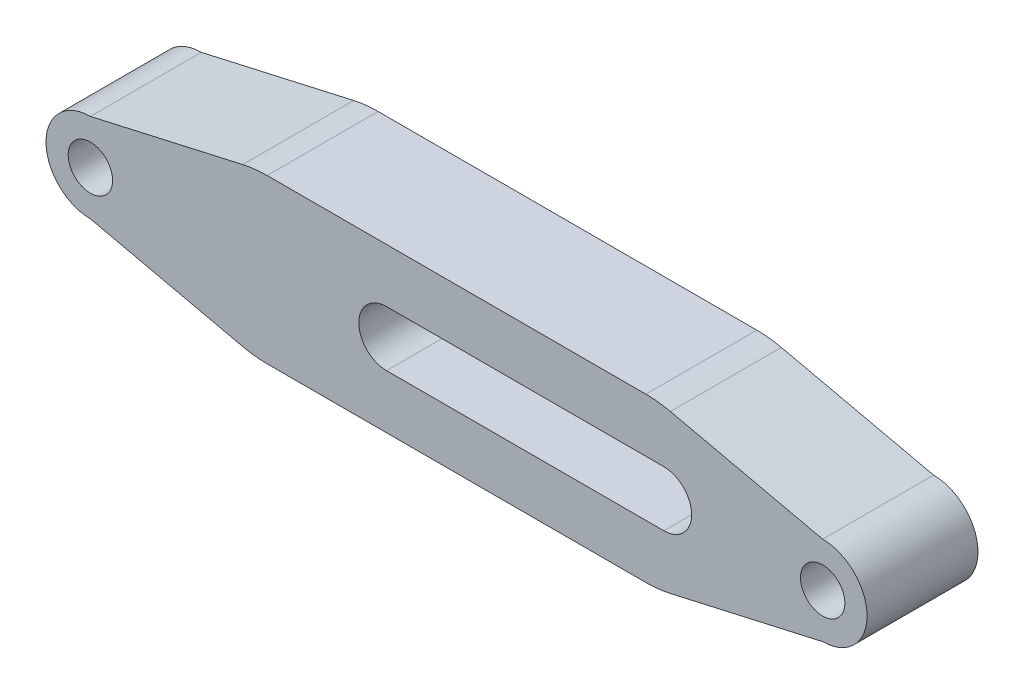
ISO-10303-21;
HEADER;
FILE_DESCRIPTION(('STEP AP214'),'2;1');
FILE_NAME('part.step','',(''),(''),'','','');
FILE_SCHEMA(('AUTOMOTIVE_DESIGN { 1 0 10303 214 1 1 1 1 }'));
ENDSEC;
DATA;
#1=APPLICATION_CONTEXT('core data for automotive mechanical design processes');
#2=APPLICATION_PROTOCOL_DEFINITION('international standard','automotive_design',2000,#1);
#3=PRODUCT_CONTEXT('',#1,'mechanical');
#4=PRODUCT('Part','Part','',(#3));
#5=PRODUCT_RELATED_PRODUCT_CATEGORY('part','',(#4));
#6=PRODUCT_DEFINITION_FORMATION('','',#4);
#7=PRODUCT_DEFINITION_CONTEXT('part definition',#1,'design');
#8=PRODUCT_DEFINITION('design','',#6,#7);
#9=PRODUCT_DEFINITION_SHAPE('','',#8);
#10=(LENGTH_UNIT() NAMED_UNIT(*) SI_UNIT(.MILLI.,.METRE.));
#11=(NAMED_UNIT(*) PLANE_ANGLE_UNIT() SI_UNIT($,.RADIAN.));
#12=(NAMED_UNIT(*) SI_UNIT($,.STERADIAN.) SOLID_ANGLE_UNIT());
#13=UNCERTAINTY_MEASURE_WITH_UNIT(LENGTH_MEASURE(1.E-05),#10,'distance_accuracy_value','');
#14=(GEOMETRIC_REPRESENTATION_CONTEXT(3) GLOBAL_UNCERTAINTY_ASSIGNED_CONTEXT((#13)) GLOBAL_UNIT_ASSIGNED_CONTEXT((#10,
#11,#12)) REPRESENTATION_CONTEXT('',''));
#15=CARTESIAN_POINT('',(0.,0.,0.));
#16=DIRECTION('',(0.,0.,1.));
#17=DIRECTION('',(1.,0.,0.));
#18=AXIS2_PLACEMENT_3D('',#15,#16,#17);
#19=CARTESIAN_POINT('',(66.,0.,10.));
#20=DIRECTION('',(0.,0.,1.));
#21=DIRECTION('',(1.,0.,0.));
#22=AXIS2_PLACEMENT_3D('',#19,#20,#21);
#23=PLANE('',#22);
#24=CARTESIAN_POINT('',(0.,0.,10.));
#25=DIRECTION('',(0.,0.,1.));
#26=DIRECTION('',(1.,0.,0.));
#27=AXIS2_PLACEMENT_3D('',#24,#25,#26);
#28=CIRCLE('',#27,2.);
#29=CARTESIAN_POINT('',(2.,0.,10.));
#30=VERTEX_POINT('',#29);
#31=EDGE_CURVE('E198',#30,#30,#28,.T.);
#32=ORIENTED_EDGE('',*,*,#31,.F.);
#33=EDGE_LOOP('',(#32));
#34=FACE_BOUND('',#33,.T.);
#35=DIRECTION('',(-1.,0.,0.));
#36=VECTOR('',#35,1.);
#37=CARTESIAN_POINT('',(14.815,7.35,10.));
#38=LINE('',#37,#36);
#39=CARTESIAN_POINT('',(50.0684834322455,7.35,10.));
#40=VERTEX_POINT('',#39);
#41=CARTESIAN_POINT('',(15.9315165677545,7.35,10.));
#42=VERTEX_POINT('',#41);
#43=EDGE_CURVE('E231',#40,#42,#38,.T.);
#44=ORIENTED_EDGE('',*,*,#43,.T.);
#45=CARTESIAN_POINT('',(15.9315165677545,-2.65,10.));
#46=DIRECTION('',(0.,0.,1.));
#47=DIRECTION('',(1.,0.,0.));
#48=AXIS2_PLACEMENT_3D('',#45,#46,#47);
#49=CIRCLE('',#48,10.);
#50=CARTESIAN_POINT('',(13.7259778814348,7.10374795159005,10.));
#51=VERTEX_POINT('',#50);
#52=EDGE_CURVE('E309',#42,#51,#49,.T.);
#53=ORIENTED_EDGE('',*,*,#52,.T.);
#54=DIRECTION('',(-0.975374795159005,-0.220553868631972,0.));
#55=VECTOR('',#54,1.);
#56=CARTESIAN_POINT('',(0.,4.,10.));
#57=LINE('',#56,#55);
#58=CARTESIAN_POINT('',(0.,4.,10.));
#59=VERTEX_POINT('',#58);
#60=EDGE_CURVE('E206',#51,#59,#57,.T.);
#61=ORIENTED_EDGE('',*,*,#60,.T.);
#62=CARTESIAN_POINT('',(0.,0.,10.));
#63=DIRECTION('',(0.,0.,1.));
#64=DIRECTION('',(1.,0.,0.));
#65=AXIS2_PLACEMENT_3D('',#62,#63,#64);
#66=CIRCLE('',#65,4.);
#67=CARTESIAN_POINT('',(0.,-4.,10.));
#68=VERTEX_POINT('',#67);
#69=EDGE_CURVE('E209',#59,#68,#66,.T.);
#70=ORIENTED_EDGE('',*,*,#69,.T.);
#71=DIRECTION('',(0.975374795159005,-0.220553868631972,0.));
#72=VECTOR('',#71,1.);
#73=CARTESIAN_POINT('',(0.,-4.,10.));
#74=LINE('',#73,#72);
#75=CARTESIAN_POINT('',(13.7259778814348,-7.10374795159005,10.));
#76=VERTEX_POINT('',#75);
#77=EDGE_CURVE('E213',#68,#76,#74,.T.);
#78=ORIENTED_EDGE('',*,*,#77,.T.);
#79=CARTESIAN_POINT('',(15.9315165677545,2.65,10.));
#80=DIRECTION('',(0.,0.,1.));
#81=DIRECTION('',(1.,0.,0.));
#82=AXIS2_PLACEMENT_3D('',#79,#80,#81);
#83=CIRCLE('',#82,10.);
#84=CARTESIAN_POINT('',(15.9315165677545,-7.35,10.));
#85=VERTEX_POINT('',#84);
#86=EDGE_CURVE('E300',#76,#85,#83,.T.);
#87=ORIENTED_EDGE('',*,*,#86,.T.);
#88=DIRECTION('',(1.,0.,0.));
#89=VECTOR('',#88,1.);
#90=CARTESIAN_POINT('',(14.815,-7.35,10.));
#91=LINE('',#90,#89);
#92=CARTESIAN_POINT('',(50.0684834322455,-7.35,10.));
#93=VERTEX_POINT('',#92);
#94=EDGE_CURVE('E217',#85,#93,#91,.T.);
#95=ORIENTED_EDGE('',*,*,#94,.T.);
#96=CARTESIAN_POINT('',(50.0684834322455,2.65,10.));
#97=DIRECTION('',(0.,0.,1.));
#98=DIRECTION('',(1.,0.,0.));
#99=AXIS2_PLACEMENT_3D('',#96,#97,#98);
#100=CIRCLE('',#99,10.);
#101=CARTESIAN_POINT('',(52.2740221185652,-7.10374795159005,10.));
#102=VERTEX_POINT('',#101);
#103=EDGE_CURVE('E303',#93,#102,#100,.T.);
#104=ORIENTED_EDGE('',*,*,#103,.T.);
#105=DIRECTION('',(0.975374795159005,0.220553868631972,0.));
#106=VECTOR('',#105,1.);
#107=CARTESIAN_POINT('',(51.185,-7.35,10.));
#108=LINE('',#107,#106);
#109=CARTESIAN_POINT('',(66.,-4.,10.));
#110=VERTEX_POINT('',#109);
#111=EDGE_CURVE('E221',#102,#110,#108,.T.);
#112=ORIENTED_EDGE('',*,*,#111,.T.);
#113=CARTESIAN_POINT('',(66.,0.,10.));
#114=DIRECTION('',(0.,0.,1.));
#115=DIRECTION('',(1.,0.,0.));
#116=AXIS2_PLACEMENT_3D('',#113,#114,#115);
#117=CIRCLE('',#116,4.);
#118=CARTESIAN_POINT('',(66.,4.,10.));
#119=VERTEX_POINT('',#118);
#120=EDGE_CURVE('E224',#110,#119,#117,.T.);
#121=ORIENTED_EDGE('',*,*,#120,.T.);
#122=DIRECTION('',(-0.975374795159005,0.220553868631972,0.));
#123=VECTOR('',#122,1.);
#124=CARTESIAN_POINT('',(51.185,7.35,10.));
#125=LINE('',#124,#123);
#126=CARTESIAN_POINT('',(52.2740221185652,7.10374795159005,10.));
#127=VERTEX_POINT('',#126);
#128=EDGE_CURVE('E227',#119,#127,#125,.T.);
#129=ORIENTED_EDGE('',*,*,#128,.T.);
#130=CARTESIAN_POINT('',(50.0684834322455,-2.65,10.));
#131=DIRECTION('',(0.,0.,1.));
#132=DIRECTION('',(1.,0.,0.));
#133=AXIS2_PLACEMENT_3D('',#130,#131,#132);
#134=CIRCLE('',#133,10.);
#135=EDGE_CURVE('E306',#127,#40,#134,.T.);
#136=ORIENTED_EDGE('',*,*,#135,.T.);
#137=EDGE_LOOP('',(#44,#53,#61,#70,#78,#87,#95,#104,#112,#121,#129,#136));
#138=FACE_BOUND('',#137,.T.);
#139=CARTESIAN_POINT('',(66.,0.,10.));
#140=DIRECTION('',(0.,0.,1.));
#141=DIRECTION('',(1.,0.,0.));
#142=AXIS2_PLACEMENT_3D('',#139,#140,#141);
#143=CIRCLE('',#142,2.);
#144=CARTESIAN_POINT('',(68.,0.,10.));
#145=VERTEX_POINT('',#144);
#146=EDGE_CURVE('E190',#145,#145,#143,.T.);
#147=ORIENTED_EDGE('',*,*,#146,.F.);
#148=EDGE_LOOP('',(#147));
#149=FACE_BOUND('',#148,.T.);
#150=DIRECTION('',(-1.,0.,0.));
#151=VECTOR('',#150,1.);
#152=CARTESIAN_POINT('',(51.69,2.5,10.));
#153=LINE('',#152,#151);
#154=CARTESIAN_POINT('',(51.69,2.5,10.));
#155=VERTEX_POINT('',#154);
#156=CARTESIAN_POINT('',(26.69,2.5,10.));
#157=VERTEX_POINT('',#156);
#158=EDGE_CURVE('E156',#155,#157,#153,.T.);
#159=ORIENTED_EDGE('',*,*,#158,.F.);
#160=CARTESIAN_POINT('',(51.69,0.,10.));
#161=DIRECTION('',(0.,0.,1.));
#162=DIRECTION('',(1.,0.,0.));
#163=AXIS2_PLACEMENT_3D('',#160,#161,#162);
#164=CIRCLE('',#163,2.5);
#165=CARTESIAN_POINT('',(51.69,-2.5,10.));
#166=VERTEX_POINT('',#165);
#167=EDGE_CURVE('E162',#166,#155,#164,.T.);
#168=ORIENTED_EDGE('',*,*,#167,.F.);
#169=DIRECTION('',(1.,0.,0.));
#170=VECTOR('',#169,1.);
#171=CARTESIAN_POINT('',(51.69,-2.5,10.));
#172=LINE('',#171,#170);
#173=CARTESIAN_POINT('',(26.69,-2.50000000000001,10.));
#174=VERTEX_POINT('',#173);
#175=EDGE_CURVE('E169',#174,#166,#172,.T.);
#176=ORIENTED_EDGE('',*,*,#175,.F.);
#177=CARTESIAN_POINT('',(26.69,0.,10.));
#178=DIRECTION('',(0.,0.,1.));
#179=DIRECTION('',(1.,0.,0.));
#180=AXIS2_PLACEMENT_3D('',#177,#178,#179);
#181=CIRCLE('',#180,2.5);
#182=EDGE_CURVE('E55',#157,#174,#181,.T.);
#183=ORIENTED_EDGE('',*,*,#182,.F.);
#184=EDGE_LOOP('',(#159,#168,#176,#183));
#185=FACE_BOUND('',#184,.T.);
#186=ADVANCED_FACE('F39',(#34,#138,#149,#185),#23,.T.);
#187=CARTESIAN_POINT('',(66.,0.,0.));
#188=DIRECTION('',(0.,0.,1.));
#189=DIRECTION('',(1.,0.,0.));
#190=AXIS2_PLACEMENT_3D('',#187,#188,#189);
#191=PLANE('',#190);
#192=CARTESIAN_POINT('',(66.,0.,0.));
#193=DIRECTION('',(0.,0.,1.));
#194=DIRECTION('',(1.,0.,0.));
#195=AXIS2_PLACEMENT_3D('',#192,#193,#194);
#196=CIRCLE('',#195,2.);
#197=CARTESIAN_POINT('',(68.,0.,0.));
#198=VERTEX_POINT('',#197);
#199=EDGE_CURVE('E174',#198,#198,#196,.T.);
#200=ORIENTED_EDGE('',*,*,#199,.T.);
#201=EDGE_LOOP('',(#200));
#202=FACE_BOUND('',#201,.T.);
#203=CARTESIAN_POINT('',(0.,0.,0.));
#204=DIRECTION('',(0.,0.,1.));
#205=DIRECTION('',(1.,0.,0.));
#206=AXIS2_PLACEMENT_3D('',#203,#204,#205);
#207=CIRCLE('',#206,2.);
#208=CARTESIAN_POINT('',(2.,0.,0.));
#209=VERTEX_POINT('',#208);
#210=EDGE_CURVE('E194',#209,#209,#207,.T.);
#211=ORIENTED_EDGE('',*,*,#210,.T.);
#212=EDGE_LOOP('',(#211));
#213=FACE_BOUND('',#212,.T.);
#214=DIRECTION('',(-0.975374795159005,-0.220553868631972,0.));
#215=VECTOR('',#214,1.);
#216=CARTESIAN_POINT('',(0.,4.,0.));
#217=LINE('',#216,#215);
#218=CARTESIAN_POINT('',(13.7259778814348,7.10374795159005,0.));
#219=VERTEX_POINT('',#218);
#220=CARTESIAN_POINT('',(0.,4.,0.));
#221=VERTEX_POINT('',#220);
#222=EDGE_CURVE('E202',#219,#221,#217,.T.);
#223=ORIENTED_EDGE('',*,*,#222,.F.);
#224=CARTESIAN_POINT('',(15.9315165677545,-2.65,0.));
#225=DIRECTION('',(0.,0.,1.));
#226=DIRECTION('',(1.,0.,0.));
#227=AXIS2_PLACEMENT_3D('',#224,#225,#226);
#228=CIRCLE('',#227,10.);
#229=CARTESIAN_POINT('',(15.9315165677545,7.35,0.));
#230=VERTEX_POINT('',#229);
#231=EDGE_CURVE('E290',#219,#230,#228,.F.);
#232=ORIENTED_EDGE('',*,*,#231,.T.);
#233=DIRECTION('',(-1.,0.,0.));
#234=VECTOR('',#233,1.);
#235=CARTESIAN_POINT('',(14.815,7.35,0.));
#236=LINE('',#235,#234);
#237=CARTESIAN_POINT('',(50.0684834322455,7.35,0.));
#238=VERTEX_POINT('',#237);
#239=EDGE_CURVE('E210',#238,#230,#236,.T.);
#240=ORIENTED_EDGE('',*,*,#239,.F.);
#241=CARTESIAN_POINT('',(50.0684834322455,-2.65,0.));
#242=DIRECTION('',(0.,0.,1.));
#243=DIRECTION('',(1.,0.,0.));
#244=AXIS2_PLACEMENT_3D('',#241,#242,#243);
#245=CIRCLE('',#244,10.);
#246=CARTESIAN_POINT('',(52.2740221185652,7.10374795159005,0.));
#247=VERTEX_POINT('',#246);
#248=EDGE_CURVE('E287',#238,#247,#245,.F.);
#249=ORIENTED_EDGE('',*,*,#248,.T.);
#250=DIRECTION('',(-0.975374795159005,0.220553868631972,0.));
#251=VECTOR('',#250,1.);
#252=CARTESIAN_POINT('',(51.185,7.35,0.));
#253=LINE('',#252,#251);
#254=CARTESIAN_POINT('',(66.,4.,0.));
#255=VERTEX_POINT('',#254);
#256=EDGE_CURVE('E255',#255,#247,#253,.T.);
#257=ORIENTED_EDGE('',*,*,#256,.F.);
#258=CARTESIAN_POINT('',(66.,0.,0.));
#259=DIRECTION('',(0.,0.,1.));
#260=DIRECTION('',(1.,0.,0.));
#261=AXIS2_PLACEMENT_3D('',#258,#259,#260);
#262=CIRCLE('',#261,4.);
#263=CARTESIAN_POINT('',(66.,-4.,0.));
#264=VERTEX_POINT('',#263);
#265=EDGE_CURVE('E252',#264,#255,#262,.T.);
#266=ORIENTED_EDGE('',*,*,#265,.F.);
#267=DIRECTION('',(0.975374795159005,0.220553868631972,0.));
#268=VECTOR('',#267,1.);
#269=CARTESIAN_POINT('',(51.185,-7.35,0.));
#270=LINE('',#269,#268);
#271=CARTESIAN_POINT('',(52.2740221185652,-7.10374795159005,0.));
#272=VERTEX_POINT('',#271);
#273=EDGE_CURVE('E249',#272,#264,#270,.T.);
#274=ORIENTED_EDGE('',*,*,#273,.F.);
#275=CARTESIAN_POINT('',(50.0684834322455,2.65,0.));
#276=DIRECTION('',(0.,0.,1.));
#277=DIRECTION('',(1.,0.,0.));
#278=AXIS2_PLACEMENT_3D('',#275,#276,#277);
#279=CIRCLE('',#278,10.);
#280=CARTESIAN_POINT('',(50.0684834322455,-7.35,0.));
#281=VERTEX_POINT('',#280);
#282=EDGE_CURVE('E284',#272,#281,#279,.F.);
#283=ORIENTED_EDGE('',*,*,#282,.T.);
#284=DIRECTION('',(1.,0.,0.));
#285=VECTOR('',#284,1.);
#286=CARTESIAN_POINT('',(14.815,-7.35,0.));
#287=LINE('',#286,#285);
#288=CARTESIAN_POINT('',(15.9315165677545,-7.35,0.));
#289=VERTEX_POINT('',#288);
#290=EDGE_CURVE('E245',#289,#281,#287,.T.);
#291=ORIENTED_EDGE('',*,*,#290,.F.);
#292=CARTESIAN_POINT('',(15.9315165677545,2.65,0.));
#293=DIRECTION('',(0.,0.,1.));
#294=DIRECTION('',(1.,0.,0.));
#295=AXIS2_PLACEMENT_3D('',#292,#293,#294);
#296=CIRCLE('',#295,10.);
#297=CARTESIAN_POINT('',(13.7259778814348,-7.10374795159005,0.));
#298=VERTEX_POINT('',#297);
#299=EDGE_CURVE('E281',#289,#298,#296,.F.);
#300=ORIENTED_EDGE('',*,*,#299,.T.);
#301=DIRECTION('',(0.975374795159005,-0.220553868631972,0.));
#302=VECTOR('',#301,1.);
#303=CARTESIAN_POINT('',(0.,-4.,0.));
#304=LINE('',#303,#302);
#305=CARTESIAN_POINT('',(0.,-4.,0.));
#306=VERTEX_POINT('',#305);
#307=EDGE_CURVE('E241',#306,#298,#304,.T.);
#308=ORIENTED_EDGE('',*,*,#307,.F.);
#309=CARTESIAN_POINT('',(0.,0.,0.));
#310=DIRECTION('',(0.,0.,1.));
#311=DIRECTION('',(1.,0.,0.));
#312=AXIS2_PLACEMENT_3D('',#309,#310,#311);
#313=CIRCLE('',#312,4.);
#314=EDGE_CURVE('E238',#221,#306,#313,.T.);
#315=ORIENTED_EDGE('',*,*,#314,.F.);
#316=EDGE_LOOP('',(#223,#232,#240,#249,#257,#266,#274,#283,#291,#300,#308,#315));
#317=FACE_BOUND('',#316,.T.);
#318=CARTESIAN_POINT('',(51.69,0.,0.));
#319=DIRECTION('',(0.,0.,1.));
#320=DIRECTION('',(1.,0.,0.));
#321=AXIS2_PLACEMENT_3D('',#318,#319,#320);
#322=CIRCLE('',#321,2.5);
#323=CARTESIAN_POINT('',(51.69,-2.5,0.));
#324=VERTEX_POINT('',#323);
#325=CARTESIAN_POINT('',(51.69,2.5,0.));
#326=VERTEX_POINT('',#325);
#327=EDGE_CURVE('E63',#324,#326,#322,.T.);
#328=ORIENTED_EDGE('',*,*,#327,.T.);
#329=DIRECTION('',(-1.,0.,0.));
#330=VECTOR('',#329,1.);
#331=CARTESIAN_POINT('',(51.69,2.5,0.));
#332=LINE('',#331,#330);
#333=CARTESIAN_POINT('',(26.69,2.5,0.));
#334=VERTEX_POINT('',#333);
#335=EDGE_CURVE('E158',#326,#334,#332,.T.);
#336=ORIENTED_EDGE('',*,*,#335,.T.);
#337=CARTESIAN_POINT('',(26.69,0.,0.));
#338=DIRECTION('',(0.,0.,1.));
#339=DIRECTION('',(-1.,0.,0.));
#340=AXIS2_PLACEMENT_3D('',#337,#338,#339);
#341=CIRCLE('',#340,2.5);
#342=CARTESIAN_POINT('',(26.69,-2.50000000000001,0.));
#343=VERTEX_POINT('',#342);
#344=EDGE_CURVE('E184',#334,#343,#341,.T.);
#345=ORIENTED_EDGE('',*,*,#344,.T.);
#346=DIRECTION('',(1.,0.,0.));
#347=VECTOR('',#346,1.);
#348=CARTESIAN_POINT('',(51.69,-2.5,0.));
#349=LINE('',#348,#347);
#350=EDGE_CURVE('E179',#343,#324,#349,.T.);
#351=ORIENTED_EDGE('',*,*,#350,.T.);
#352=EDGE_LOOP('',(#328,#336,#345,#351));
#353=FACE_BOUND('',#352,.T.);
#354=ADVANCED_FACE('F344',(#202,#213,#317,#353),#191,.F.);
#355=CARTESIAN_POINT('',(0.,4.,10.));
#356=DIRECTION('',(0.220553868631972,-0.975374795159005,0.));
#357=DIRECTION('',(0.975374795159005,0.220553868631972,0.));
#358=AXIS2_PLACEMENT_3D('',#355,#356,#357);
#359=PLANE('',#358);
#360=ORIENTED_EDGE('',*,*,#60,.F.);
#361=DIRECTION('',(0.,0.,-1.));
#362=VECTOR('',#361,1.);
#363=CARTESIAN_POINT('',(13.7259778814348,7.10374795159005,10.));
#364=LINE('',#363,#362);
#365=EDGE_CURVE('E277',#51,#219,#364,.T.);
#366=ORIENTED_EDGE('',*,*,#365,.T.);
#367=ORIENTED_EDGE('',*,*,#222,.T.);
#368=DIRECTION('',(0.,0.,-1.));
#369=VECTOR('',#368,1.);
#370=CARTESIAN_POINT('',(0.,4.,10.));
#371=LINE('',#370,#369);
#372=EDGE_CURVE('E273',#59,#221,#371,.T.);
#373=ORIENTED_EDGE('',*,*,#372,.F.);
#374=EDGE_LOOP('',(#360,#366,#367,#373));
#375=FACE_BOUND('',#374,.T.);
#376=ADVANCED_FACE('F371',(#375),#359,.F.);
#377=CARTESIAN_POINT('',(0.,0.,10.));
#378=DIRECTION('',(0.,0.,-1.));
#379=DIRECTION('',(-1.,0.,0.));
#380=AXIS2_PLACEMENT_3D('',#377,#378,#379);
#381=CYLINDRICAL_SURFACE('',#380,4.);
#382=ORIENTED_EDGE('',*,*,#314,.T.);
#383=DIRECTION('',(0.,0.,-1.));
#384=VECTOR('',#383,1.);
#385=CARTESIAN_POINT('',(0.,-4.,10.));
#386=LINE('',#385,#384);
#387=EDGE_CURVE('E269',#68,#306,#386,.T.);
#388=ORIENTED_EDGE('',*,*,#387,.F.);
#389=ORIENTED_EDGE('',*,*,#69,.F.);
#390=ORIENTED_EDGE('',*,*,#372,.T.);
#391=EDGE_LOOP('',(#382,#388,#389,#390));
#392=FACE_BOUND('',#391,.T.);
#393=ADVANCED_FACE('F376',(#392),#381,.T.);
#394=CARTESIAN_POINT('',(0.,-4.,10.));
#395=DIRECTION('',(0.220553868631972,0.975374795159005,0.));
#396=DIRECTION('',(-0.975374795159005,0.220553868631972,0.));
#397=AXIS2_PLACEMENT_3D('',#394,#395,#396);
#398=PLANE('',#397);
#399=ORIENTED_EDGE('',*,*,#307,.T.);
#400=DIRECTION('',(0.,0.,-1.));
#401=VECTOR('',#400,1.);
#402=CARTESIAN_POINT('',(13.7259778814348,-7.10374795159005,10.));
#403=LINE('',#402,#401);
#404=EDGE_CURVE('E11',#298,#76,#403,.F.);
#405=ORIENTED_EDGE('',*,*,#404,.T.);
#406=ORIENTED_EDGE('',*,*,#77,.F.);
#407=ORIENTED_EDGE('',*,*,#387,.T.);
#408=EDGE_LOOP('',(#399,#405,#406,#407));
#409=FACE_BOUND('',#408,.T.);
#410=ADVANCED_FACE('F380',(#409),#398,.F.);
#411=CARTESIAN_POINT('',(14.815,-7.35,10.));
#412=DIRECTION('',(0.,1.,0.));
#413=DIRECTION('',(0.,0.,1.));
#414=AXIS2_PLACEMENT_3D('',#411,#412,#413);
#415=PLANE('',#414);
#416=ORIENTED_EDGE('',*,*,#290,.T.);
#417=DIRECTION('',(0.,0.,-1.));
#418=VECTOR('',#417,1.);
#419=CARTESIAN_POINT('',(50.0684834322455,-7.35,10.));
#420=LINE('',#419,#418);
#421=EDGE_CURVE('E48',#281,#93,#420,.F.);
#422=ORIENTED_EDGE('',*,*,#421,.T.);
#423=ORIENTED_EDGE('',*,*,#94,.F.);
#424=DIRECTION('',(0.,0.,-1.));
#425=VECTOR('',#424,1.);
#426=CARTESIAN_POINT('',(15.9315165677545,-7.35,10.));
#427=LINE('',#426,#425);
#428=EDGE_CURVE('E319',#85,#289,#427,.T.);
#429=ORIENTED_EDGE('',*,*,#428,.T.);
#430=EDGE_LOOP('',(#416,#422,#423,#429));
#431=FACE_BOUND('',#430,.T.);
#432=ADVANCED_FACE('F326',(#431),#415,.F.);
#433=CARTESIAN_POINT('',(51.185,-7.35,10.));
#434=DIRECTION('',(-0.220553868631972,0.975374795159005,0.));
#435=DIRECTION('',(-0.975374795159005,-0.220553868631972,0.));
#436=AXIS2_PLACEMENT_3D('',#433,#434,#435);
#437=PLANE('',#436);
#438=ORIENTED_EDGE('',*,*,#111,.F.);
#439=DIRECTION('',(0.,0.,-1.));
#440=VECTOR('',#439,1.);
#441=CARTESIAN_POINT('',(52.2740221185652,-7.10374795159005,10.));
#442=LINE('',#441,#440);
#443=EDGE_CURVE('E315',#102,#272,#442,.T.);
#444=ORIENTED_EDGE('',*,*,#443,.T.);
#445=ORIENTED_EDGE('',*,*,#273,.T.);
#446=DIRECTION('',(0.,0.,-1.));
#447=VECTOR('',#446,1.);
#448=CARTESIAN_POINT('',(66.,-4.,10.));
#449=LINE('',#448,#447);
#450=EDGE_CURVE('E265',#110,#264,#449,.T.);
#451=ORIENTED_EDGE('',*,*,#450,.F.);
#452=EDGE_LOOP('',(#438,#444,#445,#451));
#453=FACE_BOUND('',#452,.T.);
#454=ADVANCED_FACE('F339',(#453),#437,.F.);
#455=CARTESIAN_POINT('',(66.,0.,10.));
#456=DIRECTION('',(0.,0.,-1.));
#457=DIRECTION('',(-1.,0.,0.));
#458=AXIS2_PLACEMENT_3D('',#455,#456,#457);
#459=CYLINDRICAL_SURFACE('',#458,4.);
#460=ORIENTED_EDGE('',*,*,#265,.T.);
#461=DIRECTION('',(0.,0.,-1.));
#462=VECTOR('',#461,1.);
#463=CARTESIAN_POINT('',(66.,4.,10.));
#464=LINE('',#463,#462);
#465=EDGE_CURVE('E235',#119,#255,#464,.T.);
#466=ORIENTED_EDGE('',*,*,#465,.F.);
#467=ORIENTED_EDGE('',*,*,#120,.F.);
#468=ORIENTED_EDGE('',*,*,#450,.T.);
#469=EDGE_LOOP('',(#460,#466,#467,#468));
#470=FACE_BOUND('',#469,.T.);
#471=ADVANCED_FACE('F349',(#470),#459,.T.);
#472=CARTESIAN_POINT('',(51.185,7.35,10.));
#473=DIRECTION('',(-0.220553868631972,-0.975374795159005,0.));
#474=DIRECTION('',(0.975374795159005,-0.220553868631972,0.));
#475=AXIS2_PLACEMENT_3D('',#472,#473,#474);
#476=PLANE('',#475);
#477=ORIENTED_EDGE('',*,*,#256,.T.);
#478=DIRECTION('',(0.,0.,-1.));
#479=VECTOR('',#478,1.);
#480=CARTESIAN_POINT('',(52.2740221185652,7.10374795159005,10.));
#481=LINE('',#480,#479);
#482=EDGE_CURVE('E312',#247,#127,#481,.F.);
#483=ORIENTED_EDGE('',*,*,#482,.T.);
#484=ORIENTED_EDGE('',*,*,#128,.F.);
#485=ORIENTED_EDGE('',*,*,#465,.T.);
#486=EDGE_LOOP('',(#477,#483,#484,#485));
#487=FACE_BOUND('',#486,.T.);
#488=ADVANCED_FACE('F353',(#487),#476,.F.);
#489=CARTESIAN_POINT('',(14.815,7.35,10.));
#490=DIRECTION('',(0.,-1.,0.));
#491=DIRECTION('',(0.,0.,-1.));
#492=AXIS2_PLACEMENT_3D('',#489,#490,#491);
#493=PLANE('',#492);
#494=ORIENTED_EDGE('',*,*,#239,.T.);
#495=DIRECTION('',(0.,0.,-1.));
#496=VECTOR('',#495,1.);
#497=CARTESIAN_POINT('',(15.9315165677545,7.35,10.));
#498=LINE('',#497,#496);
#499=EDGE_CURVE('E297',#230,#42,#498,.F.);
#500=ORIENTED_EDGE('',*,*,#499,.T.);
#501=ORIENTED_EDGE('',*,*,#43,.F.);
#502=DIRECTION('',(0.,0.,-1.));
#503=VECTOR('',#502,1.);
#504=CARTESIAN_POINT('',(50.0684834322455,7.35,10.));
#505=LINE('',#504,#503);
#506=EDGE_CURVE('E293',#40,#238,#505,.T.);
#507=ORIENTED_EDGE('',*,*,#506,.T.);
#508=EDGE_LOOP('',(#494,#500,#501,#507));
#509=FACE_BOUND('',#508,.T.);
#510=ADVANCED_FACE('F362',(#509),#493,.F.);
#511=CARTESIAN_POINT('',(0.,0.,10.));
#512=DIRECTION('',(0.,0.,-1.));
#513=DIRECTION('',(-1.,0.,0.));
#514=AXIS2_PLACEMENT_3D('',#511,#512,#513);
#515=CYLINDRICAL_SURFACE('',#514,2.);
#516=ORIENTED_EDGE('',*,*,#31,.T.);
#517=EDGE_LOOP('',(#516));
#518=FACE_BOUND('',#517,.T.);
#519=ORIENTED_EDGE('',*,*,#210,.F.);
#520=EDGE_LOOP('',(#519));
#521=FACE_BOUND('',#520,.T.);
#522=ADVANCED_FACE('F399',(#518,#521),#515,.F.);
#523=CARTESIAN_POINT('',(66.,0.,10.));
#524=DIRECTION('',(0.,0.,-1.));
#525=DIRECTION('',(-1.,0.,0.));
#526=AXIS2_PLACEMENT_3D('',#523,#524,#525);
#527=CYLINDRICAL_SURFACE('',#526,2.);
#528=ORIENTED_EDGE('',*,*,#146,.T.);
#529=EDGE_LOOP('',(#528));
#530=FACE_BOUND('',#529,.T.);
#531=ORIENTED_EDGE('',*,*,#199,.F.);
#532=EDGE_LOOP('',(#531));
#533=FACE_BOUND('',#532,.T.);
#534=ADVANCED_FACE('F420',(#530,#533),#527,.F.);
#535=CARTESIAN_POINT('',(15.9315165677545,-2.65,10.));
#536=DIRECTION('',(0.,0.,-1.));
#537=DIRECTION('',(-1.,0.,0.));
#538=AXIS2_PLACEMENT_3D('',#535,#536,#537);
#539=CYLINDRICAL_SURFACE('',#538,10.);
#540=ORIENTED_EDGE('',*,*,#52,.F.);
#541=ORIENTED_EDGE('',*,*,#499,.F.);
#542=ORIENTED_EDGE('',*,*,#231,.F.);
#543=ORIENTED_EDGE('',*,*,#365,.F.);
#544=EDGE_LOOP('',(#540,#541,#542,#543));
#545=FACE_BOUND('',#544,.T.);
#546=ADVANCED_FACE('F368',(#545),#539,.T.);
#547=CARTESIAN_POINT('',(50.0684834322455,-2.65,10.));
#548=DIRECTION('',(0.,0.,-1.));
#549=DIRECTION('',(-1.,0.,0.));
#550=AXIS2_PLACEMENT_3D('',#547,#548,#549);
#551=CYLINDRICAL_SURFACE('',#550,10.);
#552=ORIENTED_EDGE('',*,*,#135,.F.);
#553=ORIENTED_EDGE('',*,*,#482,.F.);
#554=ORIENTED_EDGE('',*,*,#248,.F.);
#555=ORIENTED_EDGE('',*,*,#506,.F.);
#556=EDGE_LOOP('',(#552,#553,#554,#555));
#557=FACE_BOUND('',#556,.T.);
#558=ADVANCED_FACE('F359',(#557),#551,.T.);
#559=CARTESIAN_POINT('',(50.0684834322455,2.65,10.));
#560=DIRECTION('',(0.,0.,-1.));
#561=DIRECTION('',(-1.,0.,0.));
#562=AXIS2_PLACEMENT_3D('',#559,#560,#561);
#563=CYLINDRICAL_SURFACE('',#562,10.);
#564=ORIENTED_EDGE('',*,*,#103,.F.);
#565=ORIENTED_EDGE('',*,*,#421,.F.);
#566=ORIENTED_EDGE('',*,*,#282,.F.);
#567=ORIENTED_EDGE('',*,*,#443,.F.);
#568=EDGE_LOOP('',(#564,#565,#566,#567));
#569=FACE_BOUND('',#568,.T.);
#570=ADVANCED_FACE('F336',(#569),#563,.T.);
#571=CARTESIAN_POINT('',(15.9315165677545,2.65,10.));
#572=DIRECTION('',(0.,0.,-1.));
#573=DIRECTION('',(-1.,0.,0.));
#574=AXIS2_PLACEMENT_3D('',#571,#572,#573);
#575=CYLINDRICAL_SURFACE('',#574,10.);
#576=ORIENTED_EDGE('',*,*,#86,.F.);
#577=ORIENTED_EDGE('',*,*,#404,.F.);
#578=ORIENTED_EDGE('',*,*,#299,.F.);
#579=ORIENTED_EDGE('',*,*,#428,.F.);
#580=EDGE_LOOP('',(#576,#577,#578,#579));
#581=FACE_BOUND('',#580,.T.);
#582=ADVANCED_FACE('F41',(#581),#575,.T.);
#583=CARTESIAN_POINT('',(51.69,0.,40.4138126514911));
#584=DIRECTION('',(0.,0.,-1.));
#585=DIRECTION('',(-1.,0.,0.));
#586=AXIS2_PLACEMENT_3D('',#583,#584,#585);
#587=CYLINDRICAL_SURFACE('',#586,2.5);
#588=ORIENTED_EDGE('',*,*,#167,.T.);
#589=DIRECTION('',(0.,0.,-1.));
#590=VECTOR('',#589,1.);
#591=CARTESIAN_POINT('',(51.69,2.5,40.4138126514911));
#592=LINE('',#591,#590);
#593=EDGE_CURVE('E152',#155,#326,#592,.T.);
#594=ORIENTED_EDGE('',*,*,#593,.T.);
#595=ORIENTED_EDGE('',*,*,#327,.F.);
#596=DIRECTION('',(0.,0.,-1.));
#597=VECTOR('',#596,1.);
#598=CARTESIAN_POINT('',(51.69,-2.5,40.4138126514911));
#599=LINE('',#598,#597);
#600=EDGE_CURVE('E164',#166,#324,#599,.T.);
#601=ORIENTED_EDGE('',*,*,#600,.F.);
#602=EDGE_LOOP('',(#588,#594,#595,#601));
#603=FACE_BOUND('',#602,.T.);
#604=ADVANCED_FACE('F163',(#603),#587,.F.);
#605=CARTESIAN_POINT('',(51.69,2.5,40.4138126514911));
#606=DIRECTION('',(0.,-1.,0.));
#607=DIRECTION('',(1.,0.,0.));
#608=AXIS2_PLACEMENT_3D('',#605,#606,#607);
#609=PLANE('',#608);
#610=ORIENTED_EDGE('',*,*,#158,.T.);
#611=DIRECTION('',(0.,0.,-1.));
#612=VECTOR('',#611,1.);
#613=CARTESIAN_POINT('',(26.69,2.5,40.4138126514911));
#614=LINE('',#613,#612);
#615=EDGE_CURVE('E181',#157,#334,#614,.T.);
#616=ORIENTED_EDGE('',*,*,#615,.T.);
#617=ORIENTED_EDGE('',*,*,#335,.F.);
#618=ORIENTED_EDGE('',*,*,#593,.F.);
#619=EDGE_LOOP('',(#610,#616,#617,#618));
#620=FACE_BOUND('',#619,.T.);
#621=ADVANCED_FACE('F154',(#620),#609,.T.);
#622=CARTESIAN_POINT('',(26.69,0.,40.4138126514911));
#623=DIRECTION('',(0.,0.,-1.));
#624=DIRECTION('',(-1.,0.,0.));
#625=AXIS2_PLACEMENT_3D('',#622,#623,#624);
#626=CYLINDRICAL_SURFACE('',#625,2.5);
#627=ORIENTED_EDGE('',*,*,#182,.T.);
#628=DIRECTION('',(0.,0.,-1.));
#629=VECTOR('',#628,1.);
#630=CARTESIAN_POINT('',(26.69,-2.50000000000001,40.4138126514911));
#631=LINE('',#630,#629);
#632=EDGE_CURVE('E185',#174,#343,#631,.T.);
#633=ORIENTED_EDGE('',*,*,#632,.T.);
#634=ORIENTED_EDGE('',*,*,#344,.F.);
#635=ORIENTED_EDGE('',*,*,#615,.F.);
#636=EDGE_LOOP('',(#627,#633,#634,#635));
#637=FACE_BOUND('',#636,.T.);
#638=ADVANCED_FACE('F460',(#637),#626,.F.);
#639=CARTESIAN_POINT('',(51.69,-2.5,40.4138126514911));
#640=DIRECTION('',(0.,1.,0.));
#641=DIRECTION('',(-1.,0.,0.));
#642=AXIS2_PLACEMENT_3D('',#639,#640,#641);
#643=PLANE('',#642);
#644=ORIENTED_EDGE('',*,*,#175,.T.);
#645=ORIENTED_EDGE('',*,*,#600,.T.);
#646=ORIENTED_EDGE('',*,*,#350,.F.);
#647=ORIENTED_EDGE('',*,*,#632,.F.);
#648=EDGE_LOOP('',(#644,#645,#646,#647));
#649=FACE_BOUND('',#648,.T.);
#650=ADVANCED_FACE('F469',(#649),#643,.T.);
#651=CLOSED_SHELL('',(#186,#354,#376,#393,#410,#432,#454,#471,#488,#510,#522,#534,#546,#558,
#570,#582,#604,#621,#638,#650));
#652=MANIFOLD_SOLID_BREP('B2',#651);
#653=ADVANCED_BREP_SHAPE_REPRESENTATION('',(#18,#652),#14);
#654=SHAPE_DEFINITION_REPRESENTATION(#9,#653);
ENDSEC;
END-ISO-10303-21;
